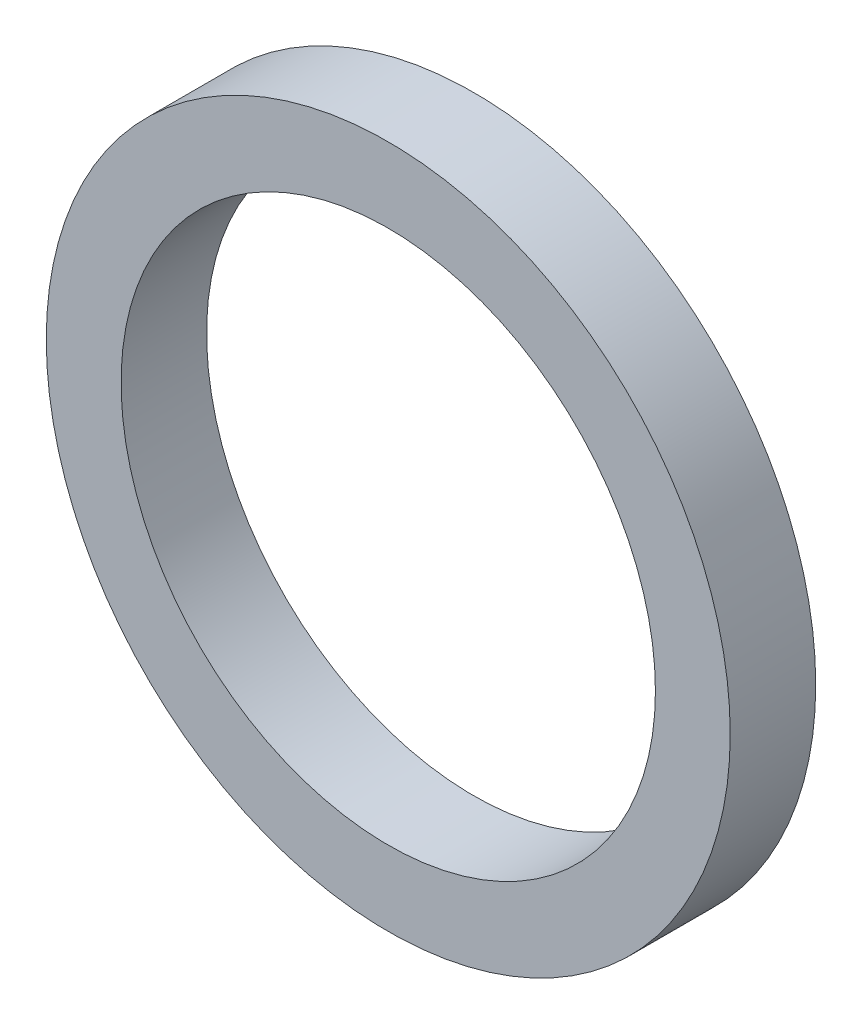
ISO-10303-21;
HEADER;
FILE_DESCRIPTION(('STEP AP214'),'2;1');
FILE_NAME('part.step','',(''),(''),'','','');
FILE_SCHEMA(('AUTOMOTIVE_DESIGN { 1 0 10303 214 1 1 1 1 }'));
ENDSEC;
DATA;
#1=APPLICATION_CONTEXT('core data for automotive mechanical design processes');
#2=APPLICATION_PROTOCOL_DEFINITION('international standard','automotive_design',2000,#1);
#3=PRODUCT_CONTEXT('',#1,'mechanical');
#4=PRODUCT('Part','Part','',(#3));
#5=PRODUCT_RELATED_PRODUCT_CATEGORY('part','',(#4));
#6=PRODUCT_DEFINITION_FORMATION('','',#4);
#7=PRODUCT_DEFINITION_CONTEXT('part definition',#1,'design');
#8=PRODUCT_DEFINITION('design','',#6,#7);
#9=PRODUCT_DEFINITION_SHAPE('','',#8);
#10=(LENGTH_UNIT() NAMED_UNIT(*) SI_UNIT(.MILLI.,.METRE.));
#11=(NAMED_UNIT(*) PLANE_ANGLE_UNIT() SI_UNIT($,.RADIAN.));
#12=(NAMED_UNIT(*) SI_UNIT($,.STERADIAN.) SOLID_ANGLE_UNIT());
#13=UNCERTAINTY_MEASURE_WITH_UNIT(LENGTH_MEASURE(1.E-05),#10,'distance_accuracy_value','');
#14=(GEOMETRIC_REPRESENTATION_CONTEXT(3) GLOBAL_UNCERTAINTY_ASSIGNED_CONTEXT((#13)) GLOBAL_UNIT_ASSIGNED_CONTEXT((#10,
#11,#12)) REPRESENTATION_CONTEXT('',''));
#15=CARTESIAN_POINT('',(0.,0.,0.));
#16=DIRECTION('',(0.,0.,1.));
#17=DIRECTION('',(1.,0.,0.));
#18=AXIS2_PLACEMENT_3D('',#15,#16,#17);
#19=CARTESIAN_POINT('',(0.,0.,4.));
#20=DIRECTION('',(0.,0.,1.));
#21=DIRECTION('',(1.,0.,0.));
#22=AXIS2_PLACEMENT_3D('',#19,#20,#21);
#23=PLANE('',#22);
#24=CARTESIAN_POINT('',(0.,0.,4.));
#25=DIRECTION('',(0.,0.,1.));
#26=DIRECTION('',(1.,0.,0.));
#27=AXIS2_PLACEMENT_3D('',#24,#25,#26);
#28=CIRCLE('',#27,16.);
#29=CARTESIAN_POINT('',(16.,0.,4.));
#30=VERTEX_POINT('',#29);
#31=EDGE_CURVE('E10',#30,#30,#28,.T.);
#32=ORIENTED_EDGE('',*,*,#31,.T.);
#33=EDGE_LOOP('',(#32));
#34=FACE_BOUND('',#33,.T.);
#35=CARTESIAN_POINT('',(0.,0.,4.));
#36=DIRECTION('',(0.,0.,1.));
#37=DIRECTION('',(1.,0.,0.));
#38=AXIS2_PLACEMENT_3D('',#35,#36,#37);
#39=CIRCLE('',#38,12.5);
#40=CARTESIAN_POINT('',(12.5,0.,4.));
#41=VERTEX_POINT('',#40);
#42=EDGE_CURVE('E56',#41,#41,#39,.T.);
#43=ORIENTED_EDGE('',*,*,#42,.F.);
#44=EDGE_LOOP('',(#43));
#45=FACE_BOUND('',#44,.T.);
#46=ADVANCED_FACE('F43',(#34,#45),#23,.T.);
#47=CARTESIAN_POINT('',(0.,0.,0.));
#48=DIRECTION('',(0.,0.,1.));
#49=DIRECTION('',(1.,0.,0.));
#50=AXIS2_PLACEMENT_3D('',#47,#48,#49);
#51=PLANE('',#50);
#52=CARTESIAN_POINT('',(0.,0.,0.));
#53=DIRECTION('',(0.,0.,1.));
#54=DIRECTION('',(1.,0.,0.));
#55=AXIS2_PLACEMENT_3D('',#52,#53,#54);
#56=CIRCLE('',#55,16.);
#57=CARTESIAN_POINT('',(16.,0.,0.));
#58=VERTEX_POINT('',#57);
#59=EDGE_CURVE('E47',#58,#58,#56,.T.);
#60=ORIENTED_EDGE('',*,*,#59,.F.);
#61=EDGE_LOOP('',(#60));
#62=FACE_BOUND('',#61,.T.);
#63=CARTESIAN_POINT('',(0.,0.,0.));
#64=DIRECTION('',(0.,0.,1.));
#65=DIRECTION('',(1.,0.,0.));
#66=AXIS2_PLACEMENT_3D('',#63,#64,#65);
#67=CIRCLE('',#66,12.5);
#68=CARTESIAN_POINT('',(12.5,0.,0.));
#69=VERTEX_POINT('',#68);
#70=EDGE_CURVE('E58',#69,#69,#67,.T.);
#71=ORIENTED_EDGE('',*,*,#70,.T.);
#72=EDGE_LOOP('',(#71));
#73=FACE_BOUND('',#72,.T.);
#74=ADVANCED_FACE('F70',(#62,#73),#51,.F.);
#75=CARTESIAN_POINT('',(0.,0.,4.));
#76=DIRECTION('',(0.,0.,-1.));
#77=DIRECTION('',(-1.,0.,0.));
#78=AXIS2_PLACEMENT_3D('',#75,#76,#77);
#79=CYLINDRICAL_SURFACE('',#78,16.);
#80=ORIENTED_EDGE('',*,*,#31,.F.);
#81=EDGE_LOOP('',(#80));
#82=FACE_BOUND('',#81,.T.);
#83=ORIENTED_EDGE('',*,*,#59,.T.);
#84=EDGE_LOOP('',(#83));
#85=FACE_BOUND('',#84,.T.);
#86=ADVANCED_FACE('F45',(#82,#85),#79,.T.);
#87=CARTESIAN_POINT('',(0.,0.,4.));
#88=DIRECTION('',(0.,0.,-1.));
#89=DIRECTION('',(-1.,0.,0.));
#90=AXIS2_PLACEMENT_3D('',#87,#88,#89);
#91=CYLINDRICAL_SURFACE('',#90,12.5);
#92=ORIENTED_EDGE('',*,*,#42,.T.);
#93=EDGE_LOOP('',(#92));
#94=FACE_BOUND('',#93,.T.);
#95=ORIENTED_EDGE('',*,*,#70,.F.);
#96=EDGE_LOOP('',(#95));
#97=FACE_BOUND('',#96,.T.);
#98=ADVANCED_FACE('F66',(#94,#97),#91,.F.);
#99=CLOSED_SHELL('',(#46,#74,#86,#98));
#100=MANIFOLD_SOLID_BREP('B2',#99);
#101=ADVANCED_BREP_SHAPE_REPRESENTATION('',(#18,#100),#14);
#102=SHAPE_DEFINITION_REPRESENTATION(#9,#101);
ENDSEC;
END-ISO-10303-21;
